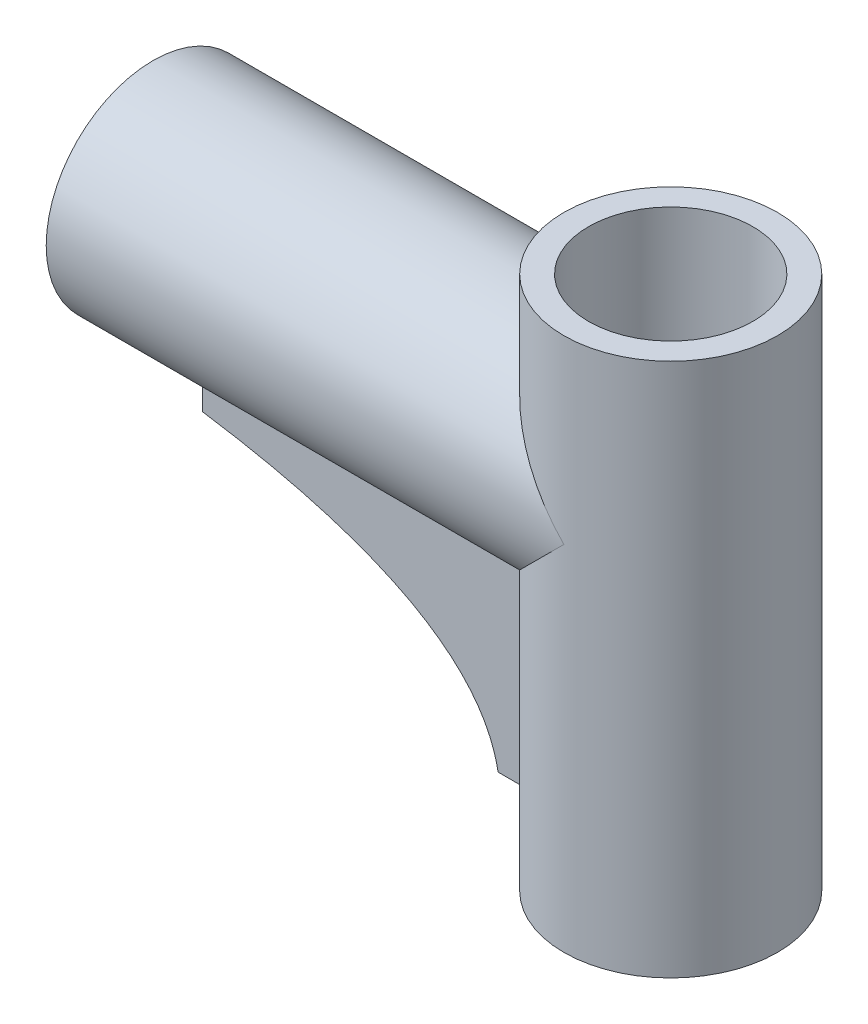
ISO-10303-21;
HEADER;
FILE_DESCRIPTION(('STEP AP214'),'2;1');
FILE_NAME('part.step','',(''),(''),'','','');
FILE_SCHEMA(('AUTOMOTIVE_DESIGN { 1 0 10303 214 1 1 1 1 }'));
ENDSEC;
DATA;
#1=APPLICATION_CONTEXT('core data for automotive mechanical design processes');
#2=APPLICATION_PROTOCOL_DEFINITION('international standard','automotive_design',2000,#1);
#3=PRODUCT_CONTEXT('',#1,'mechanical');
#4=PRODUCT('Part','Part','',(#3));
#5=PRODUCT_RELATED_PRODUCT_CATEGORY('part','',(#4));
#6=PRODUCT_DEFINITION_FORMATION('','',#4);
#7=PRODUCT_DEFINITION_CONTEXT('part definition',#1,'design');
#8=PRODUCT_DEFINITION('design','',#6,#7);
#9=PRODUCT_DEFINITION_SHAPE('','',#8);
#10=(LENGTH_UNIT() NAMED_UNIT(*) SI_UNIT(.MILLI.,.METRE.));
#11=(NAMED_UNIT(*) PLANE_ANGLE_UNIT() SI_UNIT($,.RADIAN.));
#12=(NAMED_UNIT(*) SI_UNIT($,.STERADIAN.) SOLID_ANGLE_UNIT());
#13=UNCERTAINTY_MEASURE_WITH_UNIT(LENGTH_MEASURE(1.E-05),#10,'distance_accuracy_value','');
#14=(GEOMETRIC_REPRESENTATION_CONTEXT(3) GLOBAL_UNCERTAINTY_ASSIGNED_CONTEXT((#13)) GLOBAL_UNIT_ASSIGNED_CONTEXT((#10,
#11,#12)) REPRESENTATION_CONTEXT('',''));
#15=CARTESIAN_POINT('',(0.,0.,0.));
#16=DIRECTION('',(0.,0.,1.));
#17=DIRECTION('',(1.,0.,0.));
#18=AXIS2_PLACEMENT_3D('',#15,#16,#17);
#19=CARTESIAN_POINT('',(-63.,43.,0.));
#20=DIRECTION('',(1.,0.,0.));
#21=DIRECTION('',(0.,0.,-1.));
#22=AXIS2_PLACEMENT_3D('',#19,#20,#21);
#23=CYLINDRICAL_SURFACE('',#22,13.);
#24=CARTESIAN_POINT('',(-63.,43.,0.));
#25=DIRECTION('',(-1.,0.,0.));
#26=DIRECTION('',(0.,0.,1.));
#27=AXIS2_PLACEMENT_3D('',#24,#25,#26);
#28=CIRCLE('',#27,13.);
#29=CARTESIAN_POINT('',(-63.,43.,13.));
#30=VERTEX_POINT('',#29);
#31=EDGE_CURVE('E123',#30,#30,#28,.T.);
#32=ORIENTED_EDGE('',*,*,#31,.F.);
#33=EDGE_LOOP('',(#32));
#34=FACE_BOUND('',#33,.T.);
#35=CARTESIAN_POINT('',(0.,43.,0.));
#36=DIRECTION('',(-0.707106781186547,0.707106781186548,0.));
#37=DIRECTION('',(-0.707106781186547,-0.707106781186548,0.));
#38=AXIS2_PLACEMENT_3D('',#35,#36,#37);
#39=ELLIPSE('',#38,18.3847763108502,13.);
#40=CARTESIAN_POINT('',(0.,43.,-13.));
#41=VERTEX_POINT('',#40);
#42=CARTESIAN_POINT('',(-12.,31.,-5.));
#43=VERTEX_POINT('',#42);
#44=EDGE_CURVE('E117',#41,#43,#39,.T.);
#45=ORIENTED_EDGE('',*,*,#44,.T.);
#46=DIRECTION('',(1.,0.,0.));
#47=VECTOR('',#46,1.);
#48=CARTESIAN_POINT('',(-63.,31.,-5.));
#49=LINE('',#48,#47);
#50=CARTESIAN_POINT('',(-52.,31.,-5.));
#51=VERTEX_POINT('',#50);
#52=EDGE_CURVE('E55',#43,#51,#49,.F.);
#53=ORIENTED_EDGE('',*,*,#52,.T.);
#54=CARTESIAN_POINT('',(-52.,43.,0.));
#55=DIRECTION('',(1.,0.,0.));
#56=DIRECTION('',(0.,1.,0.));
#57=AXIS2_PLACEMENT_3D('',#54,#55,#56);
#58=CIRCLE('',#57,13.);
#59=CARTESIAN_POINT('',(-52.,31.,5.));
#60=VERTEX_POINT('',#59);
#61=EDGE_CURVE('E50',#51,#60,#58,.F.);
#62=ORIENTED_EDGE('',*,*,#61,.T.);
#63=DIRECTION('',(1.,0.,0.));
#64=VECTOR('',#63,1.);
#65=CARTESIAN_POINT('',(-63.,31.,5.));
#66=LINE('',#65,#64);
#67=CARTESIAN_POINT('',(-12.,31.,5.));
#68=VERTEX_POINT('',#67);
#69=EDGE_CURVE('E111',#60,#68,#66,.T.);
#70=ORIENTED_EDGE('',*,*,#69,.T.);
#71=CARTESIAN_POINT('',(0.,43.,13.));
#72=VERTEX_POINT('',#71);
#73=EDGE_CURVE('E124',#68,#72,#39,.T.);
#74=ORIENTED_EDGE('',*,*,#73,.T.);
#75=CARTESIAN_POINT('',(0.,43.,0.));
#76=DIRECTION('',(-0.707106781186547,-0.707106781186548,0.));
#77=DIRECTION('',(-0.707106781186547,0.707106781186548,0.));
#78=AXIS2_PLACEMENT_3D('',#75,#76,#77);
#79=ELLIPSE('',#78,18.3847763108502,13.);
#80=EDGE_CURVE('E122',#72,#41,#79,.T.);
#81=ORIENTED_EDGE('',*,*,#80,.T.);
#82=EDGE_LOOP('',(#45,#53,#62,#70,#74,#81));
#83=FACE_BOUND('',#82,.T.);
#84=ADVANCED_FACE('F33',(#34,#83),#23,.T.);
#85=CARTESIAN_POINT('',(0.,65.,0.));
#86=DIRECTION('',(0.,-1.,0.));
#87=DIRECTION('',(0.,0.,-1.));
#88=AXIS2_PLACEMENT_3D('',#85,#86,#87);
#89=CYLINDRICAL_SURFACE('',#88,13.);
#90=CARTESIAN_POINT('',(0.,65.,0.));
#91=DIRECTION('',(0.,1.,0.));
#92=DIRECTION('',(0.,0.,1.));
#93=AXIS2_PLACEMENT_3D('',#90,#91,#92);
#94=CIRCLE('',#93,13.);
#95=CARTESIAN_POINT('',(0.,65.,13.));
#96=VERTEX_POINT('',#95);
#97=EDGE_CURVE('E174',#96,#96,#94,.T.);
#98=ORIENTED_EDGE('',*,*,#97,.F.);
#99=EDGE_LOOP('',(#98));
#100=FACE_BOUND('',#99,.T.);
#101=CARTESIAN_POINT('',(0.,0.,0.));
#102=DIRECTION('',(0.,1.,0.));
#103=DIRECTION('',(0.,0.,1.));
#104=AXIS2_PLACEMENT_3D('',#101,#102,#103);
#105=CIRCLE('',#104,13.);
#106=CARTESIAN_POINT('',(0.,0.,13.));
#107=VERTEX_POINT('',#106);
#108=EDGE_CURVE('E171',#107,#107,#105,.T.);
#109=ORIENTED_EDGE('',*,*,#108,.T.);
#110=EDGE_LOOP('',(#109));
#111=FACE_BOUND('',#110,.T.);
#112=DIRECTION('',(0.,-1.,0.));
#113=VECTOR('',#112,1.);
#114=CARTESIAN_POINT('',(-12.,65.,5.));
#115=LINE('',#114,#113);
#116=CARTESIAN_POINT('',(-12.,7.,5.));
#117=VERTEX_POINT('',#116);
#118=EDGE_CURVE('E470',#68,#117,#115,.T.);
#119=ORIENTED_EDGE('',*,*,#118,.T.);
#120=CARTESIAN_POINT('',(0.,7.,0.));
#121=DIRECTION('',(0.,1.,0.));
#122=DIRECTION('',(-1.,0.,0.));
#123=AXIS2_PLACEMENT_3D('',#120,#121,#122);
#124=CIRCLE('',#123,13.);
#125=CARTESIAN_POINT('',(-12.,7.,-5.));
#126=VERTEX_POINT('',#125);
#127=EDGE_CURVE('E119',#117,#126,#124,.F.);
#128=ORIENTED_EDGE('',*,*,#127,.T.);
#129=DIRECTION('',(0.,-1.,0.));
#130=VECTOR('',#129,1.);
#131=CARTESIAN_POINT('',(-12.,65.,-5.));
#132=LINE('',#131,#130);
#133=EDGE_CURVE('E105',#126,#43,#132,.F.);
#134=ORIENTED_EDGE('',*,*,#133,.T.);
#135=ORIENTED_EDGE('',*,*,#44,.F.);
#136=ORIENTED_EDGE('',*,*,#80,.F.);
#137=ORIENTED_EDGE('',*,*,#73,.F.);
#138=EDGE_LOOP('',(#119,#128,#134,#135,#136,#137));
#139=FACE_BOUND('',#138,.T.);
#140=ADVANCED_FACE('F35',(#100,#111,#139),#89,.T.);
#141=CARTESIAN_POINT('',(0.,25.,0.));
#142=DIRECTION('',(0.,-1.,0.));
#143=DIRECTION('',(0.,0.,-1.));
#144=AXIS2_PLACEMENT_3D('',#141,#142,#143);
#145=PLANE('',#144);
#146=CARTESIAN_POINT('',(0.,25.,0.));
#147=DIRECTION('',(0.,-1.,0.));
#148=DIRECTION('',(0.,0.,-1.));
#149=AXIS2_PLACEMENT_3D('',#146,#147,#148);
#150=CIRCLE('',#149,11.);
#151=CARTESIAN_POINT('',(0.,25.,-11.));
#152=VERTEX_POINT('',#151);
#153=EDGE_CURVE('E168',#152,#152,#150,.T.);
#154=ORIENTED_EDGE('',*,*,#153,.T.);
#155=EDGE_LOOP('',(#154));
#156=FACE_BOUND('',#155,.T.);
#157=CARTESIAN_POINT('',(0.,25.,0.));
#158=DIRECTION('',(0.,-1.,0.));
#159=DIRECTION('',(0.,0.,-1.));
#160=AXIS2_PLACEMENT_3D('',#157,#158,#159);
#161=CIRCLE('',#160,2.85);
#162=CARTESIAN_POINT('',(-2.35,25.,-1.61245154965971));
#163=VERTEX_POINT('',#162);
#164=CARTESIAN_POINT('',(-2.35,25.,1.61245154965971));
#165=VERTEX_POINT('',#164);
#166=EDGE_CURVE('E148',#163,#165,#161,.T.);
#167=ORIENTED_EDGE('',*,*,#166,.F.);
#168=DIRECTION('',(0.,0.,-1.));
#169=VECTOR('',#168,1.);
#170=CARTESIAN_POINT('',(-2.35,25.,1.61245154965971));
#171=LINE('',#170,#169);
#172=EDGE_CURVE('E152',#165,#163,#171,.T.);
#173=ORIENTED_EDGE('',*,*,#172,.F.);
#174=EDGE_LOOP('',(#167,#173));
#175=FACE_BOUND('',#174,.T.);
#176=CARTESIAN_POINT('',(5.5,25.,0.));
#177=DIRECTION('',(0.,-1.,0.));
#178=DIRECTION('',(0.,0.,-1.));
#179=AXIS2_PLACEMENT_3D('',#176,#177,#178);
#180=CIRCLE('',#179,0.899999999999999);
#181=CARTESIAN_POINT('',(5.5,25.,-0.899999999999999));
#182=VERTEX_POINT('',#181);
#183=EDGE_CURVE('E141',#182,#182,#180,.T.);
#184=ORIENTED_EDGE('',*,*,#183,.F.);
#185=EDGE_LOOP('',(#184));
#186=FACE_BOUND('',#185,.T.);
#187=CARTESIAN_POINT('',(-5.5,25.,0.));
#188=DIRECTION('',(0.,-1.,0.));
#189=DIRECTION('',(0.,0.,1.));
#190=AXIS2_PLACEMENT_3D('',#187,#188,#189);
#191=CIRCLE('',#190,0.899999999999999);
#192=CARTESIAN_POINT('',(-5.5,25.,0.899999999999999));
#193=VERTEX_POINT('',#192);
#194=EDGE_CURVE('E142',#193,#193,#191,.T.);
#195=ORIENTED_EDGE('',*,*,#194,.F.);
#196=EDGE_LOOP('',(#195));
#197=FACE_BOUND('',#196,.T.);
#198=CARTESIAN_POINT('',(0.,25.,7.55));
#199=DIRECTION('',(0.,-1.,0.));
#200=DIRECTION('',(0.,0.,-1.));
#201=AXIS2_PLACEMENT_3D('',#198,#199,#200);
#202=CIRCLE('',#201,2.45);
#203=CARTESIAN_POINT('',(0.,25.,5.1));
#204=VERTEX_POINT('',#203);
#205=EDGE_CURVE('E127',#204,#204,#202,.T.);
#206=ORIENTED_EDGE('',*,*,#205,.F.);
#207=EDGE_LOOP('',(#206));
#208=FACE_BOUND('',#207,.T.);
#209=CARTESIAN_POINT('',(0.,25.,-7.55));
#210=DIRECTION('',(0.,1.,0.));
#211=DIRECTION('',(0.,0.,1.));
#212=AXIS2_PLACEMENT_3D('',#209,#210,#211);
#213=CIRCLE('',#212,2.45);
#214=CARTESIAN_POINT('',(0.,25.,-5.1));
#215=VERTEX_POINT('',#214);
#216=EDGE_CURVE('E132',#215,#215,#213,.T.);
#217=ORIENTED_EDGE('',*,*,#216,.T.);
#218=EDGE_LOOP('',(#217));
#219=FACE_BOUND('',#218,.T.);
#220=ADVANCED_FACE('F207',(#156,#175,#186,#197,#208,#219),#145,.T.);
#221=CARTESIAN_POINT('',(0.,30.,0.));
#222=DIRECTION('',(0.,1.,0.));
#223=DIRECTION('',(0.,0.,1.));
#224=AXIS2_PLACEMENT_3D('',#221,#222,#223);
#225=PLANE('',#224);
#226=CARTESIAN_POINT('',(0.,30.,0.));
#227=DIRECTION('',(0.,1.,0.));
#228=DIRECTION('',(0.,0.,1.));
#229=AXIS2_PLACEMENT_3D('',#226,#227,#228);
#230=CIRCLE('',#229,2.85);
#231=CARTESIAN_POINT('',(-2.35,30.,1.61245154965971));
#232=VERTEX_POINT('',#231);
#233=CARTESIAN_POINT('',(-2.35,30.,-1.61245154965971));
#234=VERTEX_POINT('',#233);
#235=EDGE_CURVE('E11',#232,#234,#230,.T.);
#236=ORIENTED_EDGE('',*,*,#235,.F.);
#237=DIRECTION('',(0.,0.,1.));
#238=VECTOR('',#237,1.);
#239=CARTESIAN_POINT('',(-2.35,30.,0.));
#240=LINE('',#239,#238);
#241=EDGE_CURVE('E42',#234,#232,#240,.T.);
#242=ORIENTED_EDGE('',*,*,#241,.F.);
#243=EDGE_LOOP('',(#236,#242));
#244=FACE_BOUND('',#243,.T.);
#245=CARTESIAN_POINT('',(0.,30.,0.));
#246=DIRECTION('',(0.,1.,0.));
#247=DIRECTION('',(0.,0.,1.));
#248=AXIS2_PLACEMENT_3D('',#245,#246,#247);
#249=CIRCLE('',#248,10.);
#250=CARTESIAN_POINT('',(0.,30.,10.));
#251=VERTEX_POINT('',#250);
#252=CARTESIAN_POINT('',(0.,30.,-10.));
#253=VERTEX_POINT('',#252);
#254=EDGE_CURVE('E161',#251,#253,#249,.T.);
#255=ORIENTED_EDGE('',*,*,#254,.T.);
#256=CARTESIAN_POINT('',(0.,30.,-7.55));
#257=DIRECTION('',(0.,1.,0.));
#258=DIRECTION('',(0.,0.,1.));
#259=AXIS2_PLACEMENT_3D('',#256,#257,#258);
#260=CIRCLE('',#259,2.45);
#261=EDGE_CURVE('E37',#253,#253,#260,.F.);
#262=ORIENTED_EDGE('',*,*,#261,.T.);
#263=EDGE_CURVE('E165',#253,#251,#249,.T.);
#264=ORIENTED_EDGE('',*,*,#263,.T.);
#265=CARTESIAN_POINT('',(0.,30.,7.55));
#266=DIRECTION('',(0.,1.,0.));
#267=DIRECTION('',(0.,0.,1.));
#268=AXIS2_PLACEMENT_3D('',#265,#266,#267);
#269=CIRCLE('',#268,2.45);
#270=EDGE_CURVE('E135',#251,#251,#269,.T.);
#271=ORIENTED_EDGE('',*,*,#270,.F.);
#272=EDGE_LOOP('',(#255,#262,#264,#271));
#273=FACE_BOUND('',#272,.T.);
#274=ADVANCED_FACE('F185',(#244,#273),#225,.T.);
#275=CARTESIAN_POINT('',(0.,65.,0.));
#276=DIRECTION('',(0.,1.,0.));
#277=DIRECTION('',(0.,0.,1.));
#278=AXIS2_PLACEMENT_3D('',#275,#276,#277);
#279=PLANE('',#278);
#280=CARTESIAN_POINT('',(0.,65.,0.));
#281=DIRECTION('',(0.,1.,0.));
#282=DIRECTION('',(0.,0.,1.));
#283=AXIS2_PLACEMENT_3D('',#280,#281,#282);
#284=CIRCLE('',#283,10.);
#285=CARTESIAN_POINT('',(0.,65.,10.));
#286=VERTEX_POINT('',#285);
#287=EDGE_CURVE('E158',#286,#286,#284,.T.);
#288=ORIENTED_EDGE('',*,*,#287,.F.);
#289=EDGE_LOOP('',(#288));
#290=FACE_BOUND('',#289,.T.);
#291=ORIENTED_EDGE('',*,*,#97,.T.);
#292=EDGE_LOOP('',(#291));
#293=FACE_BOUND('',#292,.T.);
#294=ADVANCED_FACE('F198',(#290,#293),#279,.T.);
#295=CARTESIAN_POINT('',(0.,0.,0.));
#296=DIRECTION('',(0.,1.,0.));
#297=DIRECTION('',(0.,0.,1.));
#298=AXIS2_PLACEMENT_3D('',#295,#296,#297);
#299=PLANE('',#298);
#300=CARTESIAN_POINT('',(0.,0.,0.));
#301=DIRECTION('',(0.,-1.,0.));
#302=DIRECTION('',(0.,0.,-1.));
#303=AXIS2_PLACEMENT_3D('',#300,#301,#302);
#304=CIRCLE('',#303,11.);
#305=CARTESIAN_POINT('',(0.,0.,-11.));
#306=VERTEX_POINT('',#305);
#307=EDGE_CURVE('E164',#306,#306,#304,.T.);
#308=ORIENTED_EDGE('',*,*,#307,.F.);
#309=EDGE_LOOP('',(#308));
#310=FACE_BOUND('',#309,.T.);
#311=ORIENTED_EDGE('',*,*,#108,.F.);
#312=EDGE_LOOP('',(#311));
#313=FACE_BOUND('',#312,.T.);
#314=ADVANCED_FACE('F201',(#310,#313),#299,.F.);
#315=CARTESIAN_POINT('',(0.,25.,0.));
#316=DIRECTION('',(0.,-1.,0.));
#317=DIRECTION('',(0.,0.,-1.));
#318=AXIS2_PLACEMENT_3D('',#315,#316,#317);
#319=CYLINDRICAL_SURFACE('',#318,11.);
#320=ORIENTED_EDGE('',*,*,#153,.F.);
#321=EDGE_LOOP('',(#320));
#322=FACE_BOUND('',#321,.T.);
#323=ORIENTED_EDGE('',*,*,#307,.T.);
#324=EDGE_LOOP('',(#323));
#325=FACE_BOUND('',#324,.T.);
#326=ADVANCED_FACE('F193',(#322,#325),#319,.F.);
#327=CARTESIAN_POINT('',(0.,30.,0.));
#328=DIRECTION('',(0.,1.,0.));
#329=DIRECTION('',(0.,0.,1.));
#330=AXIS2_PLACEMENT_3D('',#327,#328,#329);
#331=CYLINDRICAL_SURFACE('',#330,10.);
#332=CARTESIAN_POINT('',(-7.14142842854285,43.,7.));
#333=CARTESIAN_POINT('',(-7.14143018629167,42.8319782813949,6.9999990236623));
#334=CARTESIAN_POINT('',(-7.14738714614089,42.6639443208391,6.99393657654944));
#335=CARTESIAN_POINT('',(-7.17088925521646,42.3295572627948,6.96983658624017));
#336=CARTESIAN_POINT('',(-7.18843587662704,42.1632043815724,6.95179752170471));
#337=CARTESIAN_POINT('',(-7.23424062592134,41.8333991035884,6.90411827188392));
#338=CARTESIAN_POINT('',(-7.26251644227994,41.6699519656865,6.87445892641137));
#339=CARTESIAN_POINT('',(-7.32845762907985,41.3473438293581,6.80411832656791));
#340=CARTESIAN_POINT('',(-7.36612824046659,41.188185278445,6.76343091901974));
#341=CARTESIAN_POINT('',(-7.48996620023396,40.722172264013,6.62686788481334));
#342=CARTESIAN_POINT('',(-7.58759628391089,40.4226857787433,6.51587281541479));
#343=CARTESIAN_POINT('',(-7.80175549548529,39.8473798204109,6.25784441157916));
#344=CARTESIAN_POINT('',(-7.91828593938041,39.5715619974002,6.11080856732385));
#345=CARTESIAN_POINT('',(-8.11033960117818,39.1533913187697,5.85121830319758));
#346=CARTESIAN_POINT('',(-8.18297196660032,39.0028786724215,5.7494246317095));
#347=CARTESIAN_POINT('',(-8.32964368705872,38.7105975852071,5.5347910818566));
#348=CARTESIAN_POINT('',(-8.40368326924359,38.5688305719867,5.42194940774214));
#349=CARTESIAN_POINT('',(-8.55165100083503,38.2942465212183,5.18543669035612));
#350=CARTESIAN_POINT('',(-8.62557891984386,38.1614401057496,5.06175318066457));
#351=CARTESIAN_POINT('',(-8.77177500493578,37.9053870081992,4.8039488428169));
#352=CARTESIAN_POINT('',(-8.84404317746629,37.7821402889777,4.66982805521406));
#353=CARTESIAN_POINT('',(-8.99734562674549,37.5260214306425,4.36817623852686));
#354=CARTESIAN_POINT('',(-9.07783012180912,37.3949754504244,4.19880488671578));
#355=CARTESIAN_POINT('',(-9.2325175428746,37.1477634633048,3.84676335916818));
#356=CARTESIAN_POINT('',(-9.30671931032578,37.0316001987955,3.66409074214644));
#357=CARTESIAN_POINT('',(-9.44662340194668,36.8157102672589,3.28660254909454));
#358=CARTESIAN_POINT('',(-9.51233937089098,36.7159571408806,3.09180723265506));
#359=CARTESIAN_POINT('',(-9.63337820162589,36.5341996693639,2.69105526598153));
#360=CARTESIAN_POINT('',(-9.68870558738317,36.4521875960656,2.48510352467088));
#361=CARTESIAN_POINT('',(-9.77386692439444,36.3269220935184,2.1205061968681));
#362=CARTESIAN_POINT('',(-9.80655405258775,36.2791783357749,1.96405313321121));
#363=CARTESIAN_POINT('',(-9.86476155172917,36.194526620751,1.64694983046412));
#364=CARTESIAN_POINT('',(-9.89028344207845,36.1576163661318,1.48630048911141));
#365=CARTESIAN_POINT('',(-9.9336184900726,36.0951261688612,1.16188987494491));
#366=CARTESIAN_POINT('',(-9.95143645765166,36.0695391563227,0.998130610681575));
#367=CARTESIAN_POINT('',(-9.97899894046171,36.0300200176319,0.668526175061588));
#368=CARTESIAN_POINT('',(-9.98874318158303,36.0160882871859,0.50268093307831));
#369=CARTESIAN_POINT('',(-9.99994742824232,36.0000727443379,0.169812789473089));
#370=CARTESIAN_POINT('',(-10.0013912220626,35.9980121175354,0.00278822074072942));
#371=CARTESIAN_POINT('',(-9.99591811927097,36.0058319497455,-0.330841733156777));
#372=CARTESIAN_POINT('',(-9.98900125403981,36.0157123639388,-0.497447119892926));
#373=CARTESIAN_POINT('',(-9.96696214953829,36.047269470084,-0.82902362935885));
#374=CARTESIAN_POINT('',(-9.95183800085008,36.0689489070725,-0.993994362689964));
#375=CARTESIAN_POINT('',(-9.9137205309085,36.1237915611196,-1.32108322161073));
#376=CARTESIAN_POINT('',(-9.89072720363808,36.1569547869592,-1.48320134501909));
#377=CARTESIAN_POINT('',(-9.83797577317507,36.2334265000531,-1.79982975616171));
#378=CARTESIAN_POINT('',(-9.80838639004653,36.276482660622,-1.95442927973572));
#379=CARTESIAN_POINT('',(-9.74273309883185,36.3726269847182,-2.2590878686863));
#380=CARTESIAN_POINT('',(-9.70666692071043,36.4257186659134,-2.40914532050665));
#381=CARTESIAN_POINT('',(-9.58972198909385,36.5992085263678,-2.8513086304611));
#382=CARTESIAN_POINT('',(-9.50005618043851,36.7338793759806,-3.13564081151016));
#383=CARTESIAN_POINT('',(-9.29209937486467,37.0536154931627,-3.7095023728599));
#384=CARTESIAN_POINT('',(-9.17172509018724,37.2426404479839,-3.99603318994754));
#385=CARTESIAN_POINT('',(-8.91743541227221,37.6570114542499,-4.53521948874496));
#386=CARTESIAN_POINT('',(-8.78350549354556,37.88239662421,-4.78783794310098));
#387=CARTESIAN_POINT('',(-8.567075374724,38.2662350234856,-5.16050904893901));
#388=CARTESIAN_POINT('',(-8.48602053346551,38.4142069202312,-5.29242561641769));
#389=CARTESIAN_POINT('',(-8.32424758764717,38.7209685291786,-5.54338933622082));
#390=CARTESIAN_POINT('',(-8.24352955399043,38.8797604081614,-5.6624338984112));
#391=CARTESIAN_POINT('',(-8.08459615372314,39.2077375140918,-5.88712500541873));
#392=CARTESIAN_POINT('',(-8.00638052490701,39.3769216466641,-5.99277295741234));
#393=CARTESIAN_POINT('',(-7.85488657269545,39.7252675471571,-6.19001022450654));
#394=CARTESIAN_POINT('',(-7.78160681187286,39.904426382233,-6.28160364259695));
#395=CARTESIAN_POINT('',(-7.60534487000453,40.3713682664048,-6.49513742754645));
#396=CARTESIAN_POINT('',(-7.5074777995004,40.665931943407,-6.60705346481421));
#397=CARTESIAN_POINT('',(-7.38270173566767,41.1223156479061,-6.7453383752463));
#398=CARTESIAN_POINT('',(-7.34478952819616,41.2768121500039,-6.78649294430642));
#399=CARTESIAN_POINT('',(-7.2776821409373,41.5900300596529,-6.85840801911706));
#400=CARTESIAN_POINT('',(-7.24848215426589,41.7487490846179,-6.88917425776761));
#401=CARTESIAN_POINT('',(-7.19979905961954,42.0711516822894,-6.94004012097758));
#402=CARTESIAN_POINT('',(-7.18042304688242,42.2348701707195,-6.96002232958215));
#403=CARTESIAN_POINT('',(-7.15282844927678,42.5642558032699,-6.98837906894715));
#404=CARTESIAN_POINT('',(-7.1446094628675,42.7299228770443,-6.99675401745244));
#405=CARTESIAN_POINT('',(-7.13976947974043,43.0615542740466,-7.0016929758216));
#406=CARTESIAN_POINT('',(-7.14314502363275,43.2275184938484,-6.99826050859227));
#407=CARTESIAN_POINT('',(-7.161304307205,43.5581472194793,-6.97967672788664));
#408=CARTESIAN_POINT('',(-7.17608756529411,43.7228117798788,-6.96452590911506));
#409=CARTESIAN_POINT('',(-7.21348565597909,44.0265654741588,-6.92576578071661));
#410=CARTESIAN_POINT('',(-7.23472053752379,44.1660183744189,-6.90363101518228));
#411=CARTESIAN_POINT('',(-7.28431462005056,44.4421192583011,-6.8512814927383));
#412=CARTESIAN_POINT('',(-7.31267585697353,44.5787664282605,-6.82106442662274));
#413=CARTESIAN_POINT('',(-7.40718539803359,44.9837404826195,-6.71879716731887));
#414=CARTESIAN_POINT('',(-7.48275372316574,45.2470564718769,-6.63513662009826));
#415=CARTESIAN_POINT('',(-7.62903039927494,45.6895358099449,-6.46582341383206));
#416=CARTESIAN_POINT('',(-7.69576195199589,45.8725743083851,-6.38651828301967));
#417=CARTESIAN_POINT('',(-7.83588790841388,46.2292407804602,-6.21379332480557));
#418=CARTESIAN_POINT('',(-7.90928295469524,46.4028678439331,-6.12037213556396));
#419=CARTESIAN_POINT('',(-8.06035235820672,46.7406083522526,-5.92000776002273));
#420=CARTESIAN_POINT('',(-8.13803417518039,46.904704123205,-5.813040553943));
#421=CARTESIAN_POINT('',(-8.29533191566778,47.2227506490054,-5.58627867697133));
#422=CARTESIAN_POINT('',(-8.37494761450557,47.3767025747099,-5.46648549072675));
#423=CARTESIAN_POINT('',(-8.53562608952008,47.6768883419357,-5.2121148315803));
#424=CARTESIAN_POINT('',(-8.61668805091046,47.8229237179442,-5.07730255228363));
#425=CARTESIAN_POINT('',(-8.7768737749309,48.1036060374697,-4.79508353309781));
#426=CARTESIAN_POINT('',(-8.85599661767772,48.2382476475324,-4.64767095916491));
#427=CARTESIAN_POINT('',(-9.01033995944098,48.4951573440519,-4.34087827615656));
#428=CARTESIAN_POINT('',(-9.08556526381705,48.6174408529631,-4.18151352693753));
#429=CARTESIAN_POINT('',(-9.23041623429756,48.8488217571788,-3.85122086364016));
#430=CARTESIAN_POINT('',(-9.30004547413587,48.9579275907022,-3.68030045969406));
#431=CARTESIAN_POINT('',(-9.42141756634059,49.145515602917,-3.35587282777521));
#432=CARTESIAN_POINT('',(-9.47423652180438,49.2261013017509,-3.2039820676844));
#433=CARTESIAN_POINT('',(-9.57374519776322,49.3765019050576,-2.89309858008072));
#434=CARTESIAN_POINT('',(-9.62043780877652,49.4463218917289,-2.73410924960348));
#435=CARTESIAN_POINT('',(-9.70676683787635,49.5744630097259,-2.40973761388449));
#436=CARTESIAN_POINT('',(-9.74640487135517,49.6327867738435,-2.2443567827847));
#437=CARTESIAN_POINT('',(-9.81777358092734,49.7372199020236,-1.90810290844143));
#438=CARTESIAN_POINT('',(-9.84950418852466,49.7833291602812,-1.73722981763716));
#439=CARTESIAN_POINT('',(-9.90447256767984,49.8629010050169,-1.39013381628797));
#440=CARTESIAN_POINT('',(-9.9276596689584,49.8962881773348,-1.21388549433762));
#441=CARTESIAN_POINT('',(-9.96469424226281,49.9494961677017,-0.8583731455893));
#442=CARTESIAN_POINT('',(-9.97854168005385,49.9693169360226,-0.679109107739609));
#443=CARTESIAN_POINT('',(-9.99652959232546,49.9950474364746,-0.319153223915368));
#444=CARTESIAN_POINT('',(-10.0006730646955,50.0009614648793,-0.138461836211764));
#445=CARTESIAN_POINT('',(-9.99914916737408,49.9987845797547,0.222786723343462));
#446=CARTESIAN_POINT('',(-9.99348253470185,49.9906947183178,0.403343904258305));
#447=CARTESIAN_POINT('',(-9.97351406696998,49.9621170114073,0.745284910415019));
#448=CARTESIAN_POINT('',(-9.96010285358001,49.9429074426506,0.906830193871172));
#449=CARTESIAN_POINT('',(-9.92569159485362,49.8934512129211,1.22745637456053));
#450=CARTESIAN_POINT('',(-9.90468901112711,49.8632008601158,1.38653642889711));
#451=CARTESIAN_POINT('',(-9.85553312282809,49.7920684079298,1.70111983764844));
#452=CARTESIAN_POINT('',(-9.82738168589852,49.7511890853084,1.85662411468375));
#453=CARTESIAN_POINT('',(-9.76446255929426,49.6592680630194,2.16328124248838));
#454=CARTESIAN_POINT('',(-9.72969231246976,49.6082224352882,2.31443238537183));
#455=CARTESIAN_POINT('',(-9.65286748038924,49.4945874280091,2.61673415700506));
#456=CARTESIAN_POINT('',(-9.61060268624189,49.4316600789026,2.7677042521897));
#457=CARTESIAN_POINT('',(-9.52044034471285,49.2961365664725,3.06352139706714));
#458=CARTESIAN_POINT('',(-9.47254077608509,49.2235369323651,3.20836622408535));
#459=CARTESIAN_POINT('',(-9.32162265797781,48.9921931146818,3.63281647104286));
#460=CARTESIAN_POINT('',(-9.2113278321318,48.8198214730056,3.90255429580436));
#461=CARTESIAN_POINT('',(-8.95995926536146,48.4138883467868,4.4524614782626));
#462=CARTESIAN_POINT('',(-8.81676954482288,48.1749732926254,4.72766576502782));
#463=CARTESIAN_POINT('',(-8.52407991806499,47.658899846548,5.23701885825116));
#464=CARTESIAN_POINT('',(-8.37456735053941,47.3816619272496,5.47107992848971));
#465=CARTESIAN_POINT('',(-8.14356006082826,46.9165489224312,5.80557990529138));
#466=CARTESIAN_POINT('',(-8.05992256515465,46.7401725383038,5.92079621846621));
#467=CARTESIAN_POINT('',(-7.89749724671562,46.3759533071635,6.13576850578089));
#468=CARTESIAN_POINT('',(-7.81871079503575,46.1881072480008,6.23552012100398));
#469=CARTESIAN_POINT('',(-7.6693694787996,45.8019370578517,6.41830813175065));
#470=CARTESIAN_POINT('',(-7.5987947058536,45.6036400367051,6.50138532328178));
#471=CARTESIAN_POINT('',(-7.46923046120721,45.1969206133589,6.64983581943285));
#472=CARTESIAN_POINT('',(-7.41023300173184,44.9885053169925,6.71522134231458));
#473=CARTESIAN_POINT('',(-7.32452587262549,44.633339570275,6.80836954082591));
#474=CARTESIAN_POINT('',(-7.29358976418255,44.4889783210954,6.84142418302962));
#475=CARTESIAN_POINT('',(-7.23963751486414,44.1970401346294,6.8984922965734));
#476=CARTESIAN_POINT('',(-7.2166188534755,44.0494642366619,6.92250864547683));
#477=CARTESIAN_POINT('',(-7.1794210211011,43.7521917080836,6.96108008062155));
#478=CARTESIAN_POINT('',(-7.16522878198313,43.602498549938,6.97564915557999));
#479=CARTESIAN_POINT('',(-7.14623127786774,43.3018736271795,6.9951099850546));
#480=CARTESIAN_POINT('',(-7.14142684947504,43.1509417533806,7.00000087708973));
#481=CARTESIAN_POINT('',(-7.14142842854285,43.,7.));
#482=B_SPLINE_CURVE_WITH_KNOTS('',3,(#332,#333,#334,#335,#336,#337,#338,#339,#340,#341,#342,
#343,#344,#345,#346,#347,#348,#349,#350,#351,#352,#353,#354,#355,#356,#357,#358,#359,#360,#361,
#362,#363,#364,#365,#366,#367,#368,#369,#370,#371,#372,#373,#374,#375,#376,#377,#378,#379,#380,
#381,#382,#383,#384,#385,#386,#387,#388,#389,#390,#391,#392,#393,#394,#395,#396,#397,#398,#399,
#400,#401,#402,#403,#404,#405,#406,#407,#408,#409,#410,#411,#412,#413,#414,#415,#416,#417,#418,
#419,#420,#421,#422,#423,#424,#425,#426,#427,#428,#429,#430,#431,#432,#433,#434,#435,#436,#437,
#438,#439,#440,#441,#442,#443,#444,#445,#446,#447,#448,#449,#450,#451,#452,#453,#454,#455,#456,
#457,#458,#459,#460,#461,#462,#463,#464,#465,#466,#467,#468,#469,#470,#471,#472,#473,#474,#475,
#476,#477,#478,#479,#480,#481),.UNSPECIFIED.,.T.,.F.,(4,2,2,2,2,2,2,2,2,2,2,2,2,2,2,2,2,2,2,2,2,
2,2,2,2,2,2,2,2,2,2,2,2,2,2,2,2,2,2,2,2,2,2,2,2,2,2,2,2,2,2,2,2,2,2,2,2,2,2,2,2,2,2,2,2,2,2,2,2,
2,2,2,2,2,4),(0.,0.503875732824861,1.00781548310208,1.51258967903034,2.01764609877291,
3.01535411020465,4.01313162007371,4.59972531962098,5.18641452328487,5.77378740623621,
6.36115800710792,7.04655198087173,7.73207206898294,8.41647576976766,9.10058073519733,
9.60049992977604,10.1003130354097,10.5998136311711,11.0993311846952,11.5998240222418,
12.1003149812487,12.6009224290217,13.1015302595773,13.590562264365,14.079766004441,
15.0574440046463,16.1448554480277,17.2334446934465,17.875378432068,18.5174411026045,
19.1594362750793,19.8012436695907,20.7868314515599,21.2792940261753,21.7714843846984,
22.2689307818651,22.7663592754892,23.2636393672749,23.7608984669118,24.1887998829114,
24.6168236860842,25.4730025478876,26.103320779295,26.7336998592203,27.365212802551,
27.9966527251492,28.6399147163256,29.2834761735519,29.9262243061754,30.5685586532014,
31.1076556115931,31.6464972927098,32.185215427977,32.723938229589,33.2658065600243,
33.8076768766825,34.3493797688217,34.8910419653573,35.380180195779,35.8694821349852,
36.3586563749882,36.8480199904192,37.3542951617584,37.8607524956838,38.8729580507365,
40.0434522458921,41.2164129653104,41.8956995007505,42.5751771547749,43.2529715567782,
43.9302966570522,44.3837286313094,44.8370161219541,45.2896308811752,45.7422859738021),.UNSPECIFIED.);
#483=CARTESIAN_POINT('',(-7.14142842854285,43.,7.));
#484=VERTEX_POINT('',#483);
#485=EDGE_CURVE('E445',#484,#484,#482,.T.);
#486=ORIENTED_EDGE('',*,*,#485,.F.);
#487=EDGE_LOOP('',(#486));
#488=FACE_BOUND('',#487,.T.);
#489=ORIENTED_EDGE('',*,*,#263,.F.);
#490=ORIENTED_EDGE('',*,*,#254,.F.);
#491=EDGE_LOOP('',(#489,#490));
#492=FACE_BOUND('',#491,.T.);
#493=ORIENTED_EDGE('',*,*,#287,.T.);
#494=EDGE_LOOP('',(#493));
#495=FACE_BOUND('',#494,.T.);
#496=ADVANCED_FACE('F189',(#488,#492,#495),#331,.F.);
#497=CARTESIAN_POINT('',(0.,65.,0.));
#498=DIRECTION('',(0.,-1.,0.));
#499=DIRECTION('',(0.,0.,-1.));
#500=AXIS2_PLACEMENT_3D('',#497,#498,#499);
#501=CYLINDRICAL_SURFACE('',#500,2.85);
#502=ORIENTED_EDGE('',*,*,#235,.T.);
#503=DIRECTION('',(0.,-1.,0.));
#504=VECTOR('',#503,1.);
#505=CARTESIAN_POINT('',(-2.35,65.,-1.61245154965971));
#506=LINE('',#505,#504);
#507=EDGE_CURVE('E156',#234,#163,#506,.T.);
#508=ORIENTED_EDGE('',*,*,#507,.T.);
#509=ORIENTED_EDGE('',*,*,#166,.T.);
#510=DIRECTION('',(0.,-1.,0.));
#511=VECTOR('',#510,1.);
#512=CARTESIAN_POINT('',(-2.35,65.,1.61245154965971));
#513=LINE('',#512,#511);
#514=EDGE_CURVE('E155',#232,#165,#513,.T.);
#515=ORIENTED_EDGE('',*,*,#514,.F.);
#516=EDGE_LOOP('',(#502,#508,#509,#515));
#517=FACE_BOUND('',#516,.T.);
#518=ADVANCED_FACE('F192',(#517),#501,.F.);
#519=CARTESIAN_POINT('',(-2.35,65.,1.61245154965971));
#520=DIRECTION('',(-1.,0.,0.));
#521=DIRECTION('',(0.,0.,1.));
#522=AXIS2_PLACEMENT_3D('',#519,#520,#521);
#523=PLANE('',#522);
#524=ORIENTED_EDGE('',*,*,#241,.T.);
#525=ORIENTED_EDGE('',*,*,#514,.T.);
#526=ORIENTED_EDGE('',*,*,#172,.T.);
#527=ORIENTED_EDGE('',*,*,#507,.F.);
#528=EDGE_LOOP('',(#524,#525,#526,#527));
#529=FACE_BOUND('',#528,.T.);
#530=ADVANCED_FACE('F249',(#529),#523,.F.);
#531=CARTESIAN_POINT('',(5.5,23.,0.));
#532=DIRECTION('',(0.,1.,0.));
#533=DIRECTION('',(0.,0.,1.));
#534=AXIS2_PLACEMENT_3D('',#531,#532,#533);
#535=CYLINDRICAL_SURFACE('',#534,0.899999999999999);
#536=CARTESIAN_POINT('',(5.5,23.,0.));
#537=DIRECTION('',(0.,-1.,0.));
#538=DIRECTION('',(0.,0.,-1.));
#539=AXIS2_PLACEMENT_3D('',#536,#537,#538);
#540=CIRCLE('',#539,0.899999999999999);
#541=CARTESIAN_POINT('',(5.5,23.,-0.899999999999999));
#542=VERTEX_POINT('',#541);
#543=EDGE_CURVE('E145',#542,#542,#540,.T.);
#544=ORIENTED_EDGE('',*,*,#543,.F.);
#545=EDGE_LOOP('',(#544));
#546=FACE_BOUND('',#545,.T.);
#547=ORIENTED_EDGE('',*,*,#183,.T.);
#548=EDGE_LOOP('',(#547));
#549=FACE_BOUND('',#548,.T.);
#550=ADVANCED_FACE('F245',(#546,#549),#535,.T.);
#551=CARTESIAN_POINT('',(5.5,23.,0.));
#552=DIRECTION('',(0.,-1.,0.));
#553=DIRECTION('',(0.,0.,-1.));
#554=AXIS2_PLACEMENT_3D('',#551,#552,#553);
#555=PLANE('',#554);
#556=ORIENTED_EDGE('',*,*,#543,.T.);
#557=EDGE_LOOP('',(#556));
#558=FACE_BOUND('',#557,.T.);
#559=ADVANCED_FACE('F241',(#558),#555,.T.);
#560=CARTESIAN_POINT('',(-5.5,23.,0.));
#561=DIRECTION('',(0.,1.,0.));
#562=DIRECTION('',(0.,0.,1.));
#563=AXIS2_PLACEMENT_3D('',#560,#561,#562);
#564=CYLINDRICAL_SURFACE('',#563,0.899999999999999);
#565=CARTESIAN_POINT('',(-5.5,23.,0.));
#566=DIRECTION('',(0.,-1.,0.));
#567=DIRECTION('',(0.,0.,1.));
#568=AXIS2_PLACEMENT_3D('',#565,#566,#567);
#569=CIRCLE('',#568,0.899999999999999);
#570=CARTESIAN_POINT('',(-5.5,23.,0.899999999999999));
#571=VERTEX_POINT('',#570);
#572=EDGE_CURVE('E138',#571,#571,#569,.T.);
#573=ORIENTED_EDGE('',*,*,#572,.F.);
#574=EDGE_LOOP('',(#573));
#575=FACE_BOUND('',#574,.T.);
#576=ORIENTED_EDGE('',*,*,#194,.T.);
#577=EDGE_LOOP('',(#576));
#578=FACE_BOUND('',#577,.T.);
#579=ADVANCED_FACE('F237',(#575,#578),#564,.T.);
#580=CARTESIAN_POINT('',(-5.5,23.,0.));
#581=DIRECTION('',(0.,1.,0.));
#582=DIRECTION('',(0.,0.,1.));
#583=AXIS2_PLACEMENT_3D('',#580,#581,#582);
#584=PLANE('',#583);
#585=ORIENTED_EDGE('',*,*,#572,.T.);
#586=EDGE_LOOP('',(#585));
#587=FACE_BOUND('',#586,.T.);
#588=ADVANCED_FACE('F234',(#587),#584,.F.);
#589=CARTESIAN_POINT('',(0.,65.,7.55));
#590=DIRECTION('',(0.,-1.,0.));
#591=DIRECTION('',(0.,0.,-1.));
#592=AXIS2_PLACEMENT_3D('',#589,#590,#591);
#593=CYLINDRICAL_SURFACE('',#592,2.45);
#594=ORIENTED_EDGE('',*,*,#270,.T.);
#595=EDGE_LOOP('',(#594));
#596=FACE_BOUND('',#595,.T.);
#597=ORIENTED_EDGE('',*,*,#205,.T.);
#598=EDGE_LOOP('',(#597));
#599=FACE_BOUND('',#598,.T.);
#600=ADVANCED_FACE('F231',(#596,#599),#593,.F.);
#601=CARTESIAN_POINT('',(0.,65.,-7.55));
#602=DIRECTION('',(0.,-1.,0.));
#603=DIRECTION('',(0.,0.,-1.));
#604=AXIS2_PLACEMENT_3D('',#601,#602,#603);
#605=CYLINDRICAL_SURFACE('',#604,2.45);
#606=ORIENTED_EDGE('',*,*,#261,.F.);
#607=EDGE_LOOP('',(#606));
#608=FACE_BOUND('',#607,.T.);
#609=ORIENTED_EDGE('',*,*,#216,.F.);
#610=EDGE_LOOP('',(#609));
#611=FACE_BOUND('',#610,.T.);
#612=ADVANCED_FACE('F228',(#608,#611),#605,.F.);
#613=CARTESIAN_POINT('',(-63.,43.,0.));
#614=DIRECTION('',(-1.,0.,0.));
#615=DIRECTION('',(0.,0.,1.));
#616=AXIS2_PLACEMENT_3D('',#613,#614,#615);
#617=PLANE('',#616);
#618=CARTESIAN_POINT('',(-63.,43.,0.));
#619=DIRECTION('',(-1.,0.,0.));
#620=DIRECTION('',(0.,0.,1.));
#621=AXIS2_PLACEMENT_3D('',#618,#619,#620);
#622=CIRCLE('',#621,10.);
#623=CARTESIAN_POINT('',(-63.,43.,10.));
#624=VERTEX_POINT('',#623);
#625=EDGE_CURVE('E452',#624,#624,#622,.T.);
#626=ORIENTED_EDGE('',*,*,#625,.F.);
#627=EDGE_LOOP('',(#626));
#628=FACE_BOUND('',#627,.T.);
#629=ORIENTED_EDGE('',*,*,#31,.T.);
#630=EDGE_LOOP('',(#629));
#631=FACE_BOUND('',#630,.T.);
#632=ADVANCED_FACE('F226',(#628,#631),#617,.T.);
#633=CARTESIAN_POINT('',(-23.,43.,0.));
#634=DIRECTION('',(-1.,0.,0.));
#635=DIRECTION('',(0.,0.,1.));
#636=AXIS2_PLACEMENT_3D('',#633,#634,#635);
#637=CYLINDRICAL_SURFACE('',#636,10.);
#638=CARTESIAN_POINT('',(-23.,43.,0.));
#639=DIRECTION('',(-1.,0.,0.));
#640=DIRECTION('',(0.,0.,1.));
#641=AXIS2_PLACEMENT_3D('',#638,#639,#640);
#642=CIRCLE('',#641,10.);
#643=CARTESIAN_POINT('',(-23.,43.,10.));
#644=VERTEX_POINT('',#643);
#645=EDGE_CURVE('E453',#644,#644,#642,.T.);
#646=ORIENTED_EDGE('',*,*,#645,.F.);
#647=EDGE_LOOP('',(#646));
#648=FACE_BOUND('',#647,.T.);
#649=ORIENTED_EDGE('',*,*,#625,.T.);
#650=EDGE_LOOP('',(#649));
#651=FACE_BOUND('',#650,.T.);
#652=ADVANCED_FACE('F317',(#648,#651),#637,.F.);
#653=CARTESIAN_POINT('',(-23.,43.,0.));
#654=DIRECTION('',(-1.,0.,0.));
#655=DIRECTION('',(0.,0.,1.));
#656=AXIS2_PLACEMENT_3D('',#653,#654,#655);
#657=PLANE('',#656);
#658=CARTESIAN_POINT('',(-23.,43.,0.));
#659=DIRECTION('',(-1.,0.,0.));
#660=DIRECTION('',(0.,0.,1.));
#661=AXIS2_PLACEMENT_3D('',#658,#659,#660);
#662=CIRCLE('',#661,7.);
#663=CARTESIAN_POINT('',(-23.,43.,7.));
#664=VERTEX_POINT('',#663);
#665=EDGE_CURVE('E110',#664,#664,#662,.T.);
#666=ORIENTED_EDGE('',*,*,#665,.F.);
#667=EDGE_LOOP('',(#666));
#668=FACE_BOUND('',#667,.T.);
#669=ORIENTED_EDGE('',*,*,#645,.T.);
#670=EDGE_LOOP('',(#669));
#671=FACE_BOUND('',#670,.T.);
#672=ADVANCED_FACE('F326',(#668,#671),#657,.T.);
#673=CARTESIAN_POINT('',(13.001,43.,0.));
#674=DIRECTION('',(-1.,0.,0.));
#675=DIRECTION('',(0.,0.,1.));
#676=AXIS2_PLACEMENT_3D('',#673,#674,#675);
#677=CYLINDRICAL_SURFACE('',#676,7.);
#678=ORIENTED_EDGE('',*,*,#485,.T.);
#679=EDGE_LOOP('',(#678));
#680=FACE_BOUND('',#679,.T.);
#681=ORIENTED_EDGE('',*,*,#665,.T.);
#682=EDGE_LOOP('',(#681));
#683=FACE_BOUND('',#682,.T.);
#684=ADVANCED_FACE('F343',(#680,#683),#677,.F.);
#685=CARTESIAN_POINT('',(-52.,65.001,-5.));
#686=DIRECTION('',(1.,0.,0.));
#687=DIRECTION('',(0.,1.,0.));
#688=AXIS2_PLACEMENT_3D('',#685,#686,#687);
#689=PLANE('',#688);
#690=ORIENTED_EDGE('',*,*,#61,.F.);
#691=DIRECTION('',(0.,-1.,0.));
#692=VECTOR('',#691,1.);
#693=CARTESIAN_POINT('',(-52.,65.001,-5.));
#694=LINE('',#693,#692);
#695=CARTESIAN_POINT('',(-52.,27.,-5.));
#696=VERTEX_POINT('',#695);
#697=EDGE_CURVE('E109',#51,#696,#694,.T.);
#698=ORIENTED_EDGE('',*,*,#697,.T.);
#699=DIRECTION('',(0.,0.,1.));
#700=VECTOR('',#699,1.);
#701=CARTESIAN_POINT('',(-52.,27.,-5.));
#702=LINE('',#701,#700);
#703=CARTESIAN_POINT('',(-52.,27.,5.));
#704=VERTEX_POINT('',#703);
#705=EDGE_CURVE('E434',#696,#704,#702,.T.);
#706=ORIENTED_EDGE('',*,*,#705,.T.);
#707=DIRECTION('',(0.,-1.,0.));
#708=VECTOR('',#707,1.);
#709=CARTESIAN_POINT('',(-52.,65.001,5.));
#710=LINE('',#709,#708);
#711=EDGE_CURVE('E437',#60,#704,#710,.T.);
#712=ORIENTED_EDGE('',*,*,#711,.F.);
#713=EDGE_LOOP('',(#690,#698,#706,#712));
#714=FACE_BOUND('',#713,.T.);
#715=ADVANCED_FACE('F353',(#714),#689,.F.);
#716=CARTESIAN_POINT('',(-52.,65.001,5.));
#717=DIRECTION('',(0.,0.,-1.));
#718=DIRECTION('',(-1.,0.,0.));
#719=AXIS2_PLACEMENT_3D('',#716,#717,#718);
#720=PLANE('',#719);
#721=ORIENTED_EDGE('',*,*,#69,.F.);
#722=ORIENTED_EDGE('',*,*,#711,.T.);
#723=CARTESIAN_POINT('',(-52.,27.,5.));
#724=CARTESIAN_POINT('',(-18.7803667234206,22.0222852501051,5.));
#725=CARTESIAN_POINT('',(-16.,6.99999999999997,5.));
#726=B_SPLINE_CURVE_WITH_KNOTS('',2,(#723,#724,#725),.UNSPECIFIED.,.F.,.F.,(3,3),(0.,1.),.UNSPECIFIED.);
#727=CARTESIAN_POINT('',(-16.,7.,5.));
#728=VERTEX_POINT('',#727);
#729=EDGE_CURVE('E120',#704,#728,#726,.T.);
#730=ORIENTED_EDGE('',*,*,#729,.T.);
#731=DIRECTION('',(-1.,0.,0.));
#732=VECTOR('',#731,1.);
#733=CARTESIAN_POINT('',(13.001,7.,5.));
#734=LINE('',#733,#732);
#735=EDGE_CURVE('E472',#117,#728,#734,.T.);
#736=ORIENTED_EDGE('',*,*,#735,.F.);
#737=ORIENTED_EDGE('',*,*,#118,.F.);
#738=EDGE_LOOP('',(#721,#722,#730,#736,#737));
#739=FACE_BOUND('',#738,.T.);
#740=ADVANCED_FACE('F363',(#739),#720,.F.);
#741=CARTESIAN_POINT('',(-52.,65.001,-5.));
#742=DIRECTION('',(0.,0.,1.));
#743=DIRECTION('',(1.,0.,0.));
#744=AXIS2_PLACEMENT_3D('',#741,#742,#743);
#745=PLANE('',#744);
#746=ORIENTED_EDGE('',*,*,#52,.F.);
#747=ORIENTED_EDGE('',*,*,#133,.F.);
#748=DIRECTION('',(-1.,0.,0.));
#749=VECTOR('',#748,1.);
#750=CARTESIAN_POINT('',(13.001,7.,-5.));
#751=LINE('',#750,#749);
#752=CARTESIAN_POINT('',(-16.,7.,-5.));
#753=VERTEX_POINT('',#752);
#754=EDGE_CURVE('E473',#126,#753,#751,.T.);
#755=ORIENTED_EDGE('',*,*,#754,.T.);
#756=CARTESIAN_POINT('',(-52.,27.,-5.));
#757=CARTESIAN_POINT('',(-18.7803667234206,22.0222852501051,-5.));
#758=CARTESIAN_POINT('',(-16.,6.99999999999997,-5.));
#759=B_SPLINE_CURVE_WITH_KNOTS('',2,(#756,#757,#758),.UNSPECIFIED.,.F.,.F.,(3,3),(0.,1.),.UNSPECIFIED.);
#760=EDGE_CURVE('E418',#696,#753,#759,.T.);
#761=ORIENTED_EDGE('',*,*,#760,.F.);
#762=ORIENTED_EDGE('',*,*,#697,.F.);
#763=EDGE_LOOP('',(#746,#747,#755,#761,#762));
#764=FACE_BOUND('',#763,.T.);
#765=ADVANCED_FACE('F104',(#764),#745,.F.);
#766=DIRECTION('',(0.,0.,1.));
#767=VECTOR('',#766,1.);
#768=SURFACE_OF_LINEAR_EXTRUSION('',#759,#767);
#769=DIRECTION('',(0.,0.,1.));
#770=VECTOR('',#769,1.);
#771=CARTESIAN_POINT('',(-16.,7.,-5.));
#772=LINE('',#771,#770);
#773=EDGE_CURVE('E425',#753,#728,#772,.T.);
#774=ORIENTED_EDGE('',*,*,#773,.T.);
#775=ORIENTED_EDGE('',*,*,#729,.F.);
#776=ORIENTED_EDGE('',*,*,#705,.F.);
#777=ORIENTED_EDGE('',*,*,#760,.T.);
#778=EDGE_LOOP('',(#774,#775,#776,#777));
#779=FACE_BOUND('',#778,.T.);
#780=ADVANCED_FACE('F394',(#779),#768,.T.);
#781=CARTESIAN_POINT('',(13.001,7.,5.));
#782=DIRECTION('',(0.,1.,0.));
#783=DIRECTION('',(-1.,0.,0.));
#784=AXIS2_PLACEMENT_3D('',#781,#782,#783);
#785=PLANE('',#784);
#786=ORIENTED_EDGE('',*,*,#127,.F.);
#787=ORIENTED_EDGE('',*,*,#735,.T.);
#788=ORIENTED_EDGE('',*,*,#773,.F.);
#789=ORIENTED_EDGE('',*,*,#754,.F.);
#790=EDGE_LOOP('',(#786,#787,#788,#789));
#791=FACE_BOUND('',#790,.T.);
#792=ADVANCED_FACE('F403',(#791),#785,.F.);
#793=CLOSED_SHELL('',(#84,#140,#220,#274,#294,#314,#326,#496,#518,#530,#550,#559,#579,#588,#600,
#612,#632,#652,#672,#684,#715,#740,#765,#780,#792));
#794=MANIFOLD_SOLID_BREP('B2',#793);
#795=ADVANCED_BREP_SHAPE_REPRESENTATION('',(#18,#794),#14);
#796=SHAPE_DEFINITION_REPRESENTATION(#9,#795);
ENDSEC;
END-ISO-10303-21;
